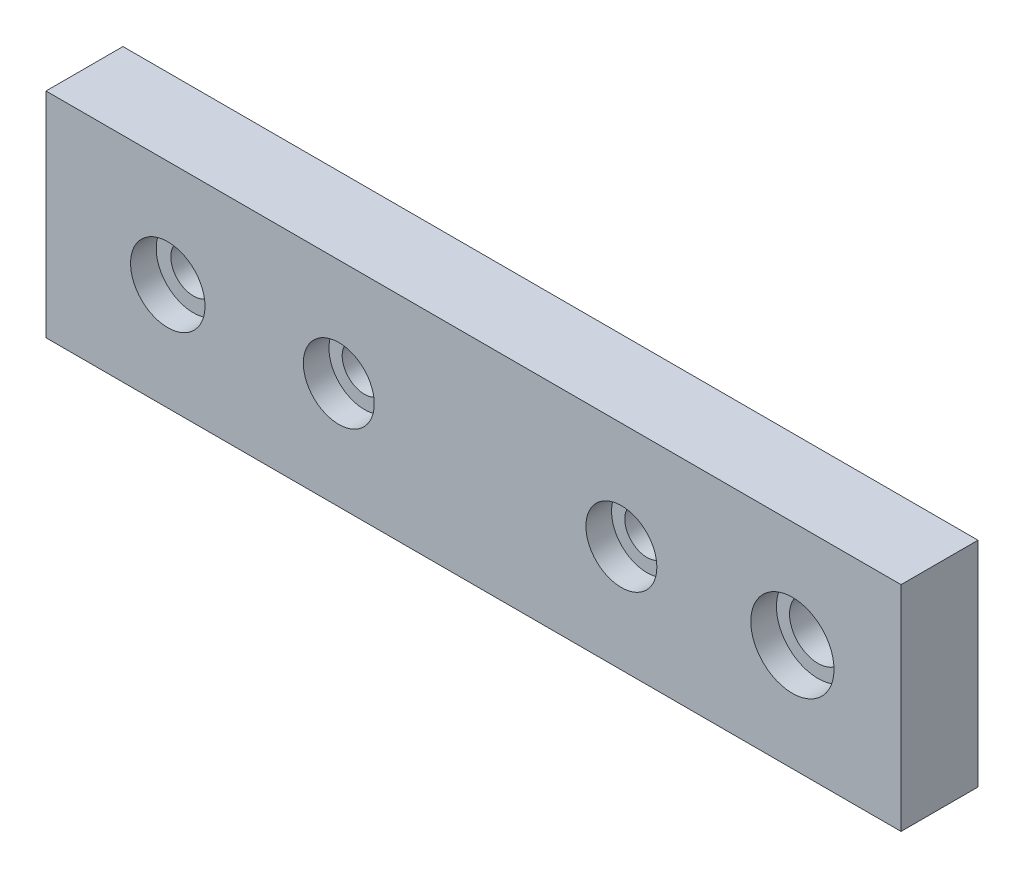
ISO-10303-21;
HEADER;
FILE_DESCRIPTION(('STEP AP214'),'2;1');
FILE_NAME('part.step','',(''),(''),'','','');
FILE_SCHEMA(('AUTOMOTIVE_DESIGN { 1 0 10303 214 1 1 1 1 }'));
ENDSEC;
DATA;
#1=APPLICATION_CONTEXT('core data for automotive mechanical design processes');
#2=APPLICATION_PROTOCOL_DEFINITION('international standard','automotive_design',2000,#1);
#3=PRODUCT_CONTEXT('',#1,'mechanical');
#4=PRODUCT('Part','Part','',(#3));
#5=PRODUCT_RELATED_PRODUCT_CATEGORY('part','',(#4));
#6=PRODUCT_DEFINITION_FORMATION('','',#4);
#7=PRODUCT_DEFINITION_CONTEXT('part definition',#1,'design');
#8=PRODUCT_DEFINITION('design','',#6,#7);
#9=PRODUCT_DEFINITION_SHAPE('','',#8);
#10=(LENGTH_UNIT() NAMED_UNIT(*) SI_UNIT(.MILLI.,.METRE.));
#11=(NAMED_UNIT(*) PLANE_ANGLE_UNIT() SI_UNIT($,.RADIAN.));
#12=(NAMED_UNIT(*) SI_UNIT($,.STERADIAN.) SOLID_ANGLE_UNIT());
#13=UNCERTAINTY_MEASURE_WITH_UNIT(LENGTH_MEASURE(1.E-05),#10,'distance_accuracy_value','');
#14=(GEOMETRIC_REPRESENTATION_CONTEXT(3) GLOBAL_UNCERTAINTY_ASSIGNED_CONTEXT((#13)) GLOBAL_UNIT_ASSIGNED_CONTEXT((#10,
#11,#12)) REPRESENTATION_CONTEXT('',''));
#15=CARTESIAN_POINT('',(0.,0.,0.));
#16=DIRECTION('',(0.,0.,1.));
#17=DIRECTION('',(1.,0.,0.));
#18=AXIS2_PLACEMENT_3D('',#15,#16,#17);
#19=CARTESIAN_POINT('',(116.291637204089,12.5,-75.));
#20=DIRECTION('',(0.,0.,1.));
#21=DIRECTION('',(1.,0.,0.));
#22=AXIS2_PLACEMENT_3D('',#19,#20,#21);
#23=CYLINDRICAL_SURFACE('',#22,3.33518087500682);
#24=CARTESIAN_POINT('',(116.291637204089,12.5,17.5));
#25=DIRECTION('',(0.,0.,1.));
#26=DIRECTION('',(1.,0.,0.));
#27=AXIS2_PLACEMENT_3D('',#24,#25,#26);
#28=CIRCLE('',#27,3.33518087500682);
#29=CARTESIAN_POINT('',(119.626818079095,12.5,17.5));
#30=VERTEX_POINT('',#29);
#31=EDGE_CURVE('E108',#30,#30,#28,.T.);
#32=ORIENTED_EDGE('',*,*,#31,.F.);
#33=EDGE_LOOP('',(#32));
#34=FACE_BOUND('',#33,.T.);
#35=CARTESIAN_POINT('',(116.291637204089,12.5,23.5));
#36=DIRECTION('',(0.,0.,1.));
#37=DIRECTION('',(1.,0.,0.));
#38=AXIS2_PLACEMENT_3D('',#35,#36,#37);
#39=CIRCLE('',#38,3.33518087500682);
#40=CARTESIAN_POINT('',(119.626818079095,12.5,23.5));
#41=VERTEX_POINT('',#40);
#42=EDGE_CURVE('E36',#41,#41,#39,.F.);
#43=ORIENTED_EDGE('',*,*,#42,.F.);
#44=EDGE_LOOP('',(#43));
#45=FACE_BOUND('',#44,.T.);
#46=ADVANCED_FACE('F32',(#34,#45),#23,.F.);
#47=CARTESIAN_POINT('',(43.2405642550662,12.5,-75.));
#48=DIRECTION('',(0.,0.,1.));
#49=DIRECTION('',(1.,0.,0.));
#50=AXIS2_PLACEMENT_3D('',#47,#48,#49);
#51=CYLINDRICAL_SURFACE('',#50,2.64345653870219);
#52=CARTESIAN_POINT('',(43.2405642550662,12.5,17.5));
#53=DIRECTION('',(0.,0.,1.));
#54=DIRECTION('',(1.,0.,0.));
#55=AXIS2_PLACEMENT_3D('',#52,#53,#54);
#56=CIRCLE('',#55,2.64345653870219);
#57=CARTESIAN_POINT('',(45.8840207937684,12.5,17.5));
#58=VERTEX_POINT('',#57);
#59=EDGE_CURVE('E111',#58,#58,#56,.T.);
#60=ORIENTED_EDGE('',*,*,#59,.F.);
#61=EDGE_LOOP('',(#60));
#62=FACE_BOUND('',#61,.T.);
#63=CARTESIAN_POINT('',(43.2405642550662,12.5,23.5));
#64=DIRECTION('',(0.,0.,1.));
#65=DIRECTION('',(1.,0.,0.));
#66=AXIS2_PLACEMENT_3D('',#63,#64,#65);
#67=CIRCLE('',#66,2.64345653870219);
#68=CARTESIAN_POINT('',(45.8840207937684,12.5,23.5));
#69=VERTEX_POINT('',#68);
#70=EDGE_CURVE('E125',#69,#69,#67,.F.);
#71=ORIENTED_EDGE('',*,*,#70,.F.);
#72=EDGE_LOOP('',(#71));
#73=FACE_BOUND('',#72,.T.);
#74=ADVANCED_FACE('F135',(#62,#73),#51,.F.);
#75=CARTESIAN_POINT('',(96.2916372040886,12.5,-75.));
#76=DIRECTION('',(0.,0.,1.));
#77=DIRECTION('',(1.,0.,0.));
#78=AXIS2_PLACEMENT_3D('',#75,#76,#77);
#79=CYLINDRICAL_SURFACE('',#78,2.6);
#80=CARTESIAN_POINT('',(96.2916372040886,12.5,17.5));
#81=DIRECTION('',(0.,0.,1.));
#82=DIRECTION('',(1.,0.,0.));
#83=AXIS2_PLACEMENT_3D('',#80,#81,#82);
#84=CIRCLE('',#83,2.6);
#85=CARTESIAN_POINT('',(98.8916372040886,12.5,17.5));
#86=VERTEX_POINT('',#85);
#87=EDGE_CURVE('E114',#86,#86,#84,.T.);
#88=ORIENTED_EDGE('',*,*,#87,.F.);
#89=EDGE_LOOP('',(#88));
#90=FACE_BOUND('',#89,.T.);
#91=CARTESIAN_POINT('',(96.2916372040886,12.5,23.5));
#92=DIRECTION('',(0.,0.,1.));
#93=DIRECTION('',(1.,0.,0.));
#94=AXIS2_PLACEMENT_3D('',#91,#92,#93);
#95=CIRCLE('',#94,2.6);
#96=CARTESIAN_POINT('',(98.8916372040886,12.5,23.5));
#97=VERTEX_POINT('',#96);
#98=EDGE_CURVE('E122',#97,#97,#95,.F.);
#99=ORIENTED_EDGE('',*,*,#98,.F.);
#100=EDGE_LOOP('',(#99));
#101=FACE_BOUND('',#100,.T.);
#102=ADVANCED_FACE('F141',(#90,#101),#79,.F.);
#103=CARTESIAN_POINT('',(63.2405642550662,12.5,-75.));
#104=DIRECTION('',(0.,0.,1.));
#105=DIRECTION('',(1.,0.,0.));
#106=AXIS2_PLACEMENT_3D('',#103,#104,#105);
#107=CYLINDRICAL_SURFACE('',#106,2.6);
#108=CARTESIAN_POINT('',(63.2405642550662,12.5,17.5));
#109=DIRECTION('',(0.,0.,1.));
#110=DIRECTION('',(1.,0.,0.));
#111=AXIS2_PLACEMENT_3D('',#108,#109,#110);
#112=CIRCLE('',#111,2.6);
#113=CARTESIAN_POINT('',(65.8405642550662,12.5,17.5));
#114=VERTEX_POINT('',#113);
#115=EDGE_CURVE('E102',#114,#114,#112,.T.);
#116=ORIENTED_EDGE('',*,*,#115,.F.);
#117=EDGE_LOOP('',(#116));
#118=FACE_BOUND('',#117,.T.);
#119=CARTESIAN_POINT('',(63.2405642550662,12.5,23.5));
#120=DIRECTION('',(0.,0.,1.));
#121=DIRECTION('',(1.,0.,0.));
#122=AXIS2_PLACEMENT_3D('',#119,#120,#121);
#123=CIRCLE('',#122,2.6);
#124=CARTESIAN_POINT('',(65.8405642550662,12.5,23.5));
#125=VERTEX_POINT('',#124);
#126=EDGE_CURVE('E119',#125,#125,#123,.F.);
#127=ORIENTED_EDGE('',*,*,#126,.F.);
#128=EDGE_LOOP('',(#127));
#129=FACE_BOUND('',#128,.T.);
#130=ADVANCED_FACE('F163',(#118,#129),#107,.F.);
#131=CARTESIAN_POINT('',(129.,0.,26.5));
#132=DIRECTION('',(-1.,0.,0.));
#133=DIRECTION('',(0.,-1.,0.));
#134=AXIS2_PLACEMENT_3D('',#131,#132,#133);
#135=PLANE('',#134);
#136=DIRECTION('',(0.,1.,0.));
#137=VECTOR('',#136,1.);
#138=CARTESIAN_POINT('',(129.,0.,17.5));
#139=LINE('',#138,#137);
#140=CARTESIAN_POINT('',(129.,0.,17.5));
#141=VERTEX_POINT('',#140);
#142=CARTESIAN_POINT('',(129.,25.,17.5));
#143=VERTEX_POINT('',#142);
#144=EDGE_CURVE('E99',#141,#143,#139,.T.);
#145=ORIENTED_EDGE('',*,*,#144,.T.);
#146=DIRECTION('',(0.,0.,-1.));
#147=VECTOR('',#146,1.);
#148=CARTESIAN_POINT('',(129.,25.,26.5));
#149=LINE('',#148,#147);
#150=CARTESIAN_POINT('',(129.,25.,26.5));
#151=VERTEX_POINT('',#150);
#152=EDGE_CURVE('E11',#151,#143,#149,.T.);
#153=ORIENTED_EDGE('',*,*,#152,.F.);
#154=DIRECTION('',(0.,1.,0.));
#155=VECTOR('',#154,1.);
#156=CARTESIAN_POINT('',(129.,0.,26.5));
#157=LINE('',#156,#155);
#158=CARTESIAN_POINT('',(129.,0.,26.5));
#159=VERTEX_POINT('',#158);
#160=EDGE_CURVE('E86',#159,#151,#157,.T.);
#161=ORIENTED_EDGE('',*,*,#160,.F.);
#162=DIRECTION('',(0.,0.,-1.));
#163=VECTOR('',#162,1.);
#164=CARTESIAN_POINT('',(129.,0.,26.5));
#165=LINE('',#164,#163);
#166=EDGE_CURVE('E95',#159,#141,#165,.T.);
#167=ORIENTED_EDGE('',*,*,#166,.T.);
#168=EDGE_LOOP('',(#145,#153,#161,#167));
#169=FACE_BOUND('',#168,.T.);
#170=ADVANCED_FACE('F34',(#169),#135,.F.);
#171=CARTESIAN_POINT('',(129.,25.,26.5));
#172=DIRECTION('',(0.,-1.,0.));
#173=DIRECTION('',(0.,0.,-1.));
#174=AXIS2_PLACEMENT_3D('',#171,#172,#173);
#175=PLANE('',#174);
#176=DIRECTION('',(-1.,0.,0.));
#177=VECTOR('',#176,1.);
#178=CARTESIAN_POINT('',(129.,25.,17.5));
#179=LINE('',#178,#177);
#180=CARTESIAN_POINT('',(29.0000000000001,25.,17.5));
#181=VERTEX_POINT('',#180);
#182=EDGE_CURVE('E90',#143,#181,#179,.T.);
#183=ORIENTED_EDGE('',*,*,#182,.T.);
#184=DIRECTION('',(0.,0.,-1.));
#185=VECTOR('',#184,1.);
#186=CARTESIAN_POINT('',(29.0000000000001,25.,26.5));
#187=LINE('',#186,#185);
#188=CARTESIAN_POINT('',(29.0000000000001,25.,26.5));
#189=VERTEX_POINT('',#188);
#190=EDGE_CURVE('E42',#189,#181,#187,.T.);
#191=ORIENTED_EDGE('',*,*,#190,.F.);
#192=DIRECTION('',(-1.,0.,0.));
#193=VECTOR('',#192,1.);
#194=CARTESIAN_POINT('',(129.,25.,26.5));
#195=LINE('',#194,#193);
#196=EDGE_CURVE('E81',#151,#189,#195,.T.);
#197=ORIENTED_EDGE('',*,*,#196,.F.);
#198=ORIENTED_EDGE('',*,*,#152,.T.);
#199=EDGE_LOOP('',(#183,#191,#197,#198));
#200=FACE_BOUND('',#199,.T.);
#201=ADVANCED_FACE('F89',(#200),#175,.F.);
#202=CARTESIAN_POINT('',(29.0000000000001,25.,26.5));
#203=DIRECTION('',(1.,0.,0.));
#204=DIRECTION('',(0.,0.,-1.));
#205=AXIS2_PLACEMENT_3D('',#202,#203,#204);
#206=PLANE('',#205);
#207=DIRECTION('',(0.,-1.,0.));
#208=VECTOR('',#207,1.);
#209=CARTESIAN_POINT('',(29.0000000000001,25.,17.5));
#210=LINE('',#209,#208);
#211=CARTESIAN_POINT('',(29.0000000000001,0.,17.5));
#212=VERTEX_POINT('',#211);
#213=EDGE_CURVE('E68',#181,#212,#210,.T.);
#214=ORIENTED_EDGE('',*,*,#213,.T.);
#215=DIRECTION('',(0.,0.,-1.));
#216=VECTOR('',#215,1.);
#217=CARTESIAN_POINT('',(29.0000000000001,0.,26.5));
#218=LINE('',#217,#216);
#219=CARTESIAN_POINT('',(29.0000000000001,0.,26.5));
#220=VERTEX_POINT('',#219);
#221=EDGE_CURVE('E91',#220,#212,#218,.T.);
#222=ORIENTED_EDGE('',*,*,#221,.F.);
#223=DIRECTION('',(0.,-1.,0.));
#224=VECTOR('',#223,1.);
#225=CARTESIAN_POINT('',(29.0000000000001,25.,26.5));
#226=LINE('',#225,#224);
#227=EDGE_CURVE('E84',#189,#220,#226,.T.);
#228=ORIENTED_EDGE('',*,*,#227,.F.);
#229=ORIENTED_EDGE('',*,*,#190,.T.);
#230=EDGE_LOOP('',(#214,#222,#228,#229));
#231=FACE_BOUND('',#230,.T.);
#232=ADVANCED_FACE('F93',(#231),#206,.F.);
#233=CARTESIAN_POINT('',(29.0000000000001,0.,26.5));
#234=DIRECTION('',(0.,1.,0.));
#235=DIRECTION('',(-1.,0.,0.));
#236=AXIS2_PLACEMENT_3D('',#233,#234,#235);
#237=PLANE('',#236);
#238=DIRECTION('',(1.,0.,0.));
#239=VECTOR('',#238,1.);
#240=CARTESIAN_POINT('',(29.0000000000001,0.,17.5));
#241=LINE('',#240,#239);
#242=EDGE_CURVE('E74',#212,#141,#241,.T.);
#243=ORIENTED_EDGE('',*,*,#242,.T.);
#244=ORIENTED_EDGE('',*,*,#166,.F.);
#245=DIRECTION('',(1.,0.,0.));
#246=VECTOR('',#245,1.);
#247=CARTESIAN_POINT('',(29.0000000000001,0.,26.5));
#248=LINE('',#247,#246);
#249=EDGE_CURVE('E51',#220,#159,#248,.T.);
#250=ORIENTED_EDGE('',*,*,#249,.F.);
#251=ORIENTED_EDGE('',*,*,#221,.T.);
#252=EDGE_LOOP('',(#243,#244,#250,#251));
#253=FACE_BOUND('',#252,.T.);
#254=ADVANCED_FACE('F150',(#253),#237,.F.);
#255=CARTESIAN_POINT('',(0.,0.,26.5));
#256=DIRECTION('',(0.,0.,1.));
#257=DIRECTION('',(1.,0.,0.));
#258=AXIS2_PLACEMENT_3D('',#255,#256,#257);
#259=PLANE('',#258);
#260=CARTESIAN_POINT('',(96.2916372040886,12.5,26.5));
#261=DIRECTION('',(0.,0.,1.));
#262=DIRECTION('',(1.,0.,0.));
#263=AXIS2_PLACEMENT_3D('',#260,#261,#262);
#264=CIRCLE('',#263,4.15);
#265=CARTESIAN_POINT('',(100.441637204089,12.5,26.5));
#266=VERTEX_POINT('',#265);
#267=EDGE_CURVE('E191',#266,#266,#264,.T.);
#268=ORIENTED_EDGE('',*,*,#267,.F.);
#269=EDGE_LOOP('',(#268));
#270=FACE_BOUND('',#269,.T.);
#271=CARTESIAN_POINT('',(63.2405642550662,12.5,26.5));
#272=DIRECTION('',(0.,0.,1.));
#273=DIRECTION('',(1.,0.,0.));
#274=AXIS2_PLACEMENT_3D('',#271,#272,#273);
#275=CIRCLE('',#274,4.15);
#276=CARTESIAN_POINT('',(67.3905642550662,12.5,26.5));
#277=VERTEX_POINT('',#276);
#278=EDGE_CURVE('E185',#277,#277,#275,.T.);
#279=ORIENTED_EDGE('',*,*,#278,.F.);
#280=EDGE_LOOP('',(#279));
#281=FACE_BOUND('',#280,.T.);
#282=CARTESIAN_POINT('',(43.2405642550662,12.5,26.5));
#283=DIRECTION('',(0.,0.,1.));
#284=DIRECTION('',(1.,0.,0.));
#285=AXIS2_PLACEMENT_3D('',#282,#283,#284);
#286=CIRCLE('',#285,4.35278385630602);
#287=CARTESIAN_POINT('',(47.5933481113722,12.5,26.5));
#288=VERTEX_POINT('',#287);
#289=EDGE_CURVE('E179',#288,#288,#286,.T.);
#290=ORIENTED_EDGE('',*,*,#289,.F.);
#291=EDGE_LOOP('',(#290));
#292=FACE_BOUND('',#291,.T.);
#293=CARTESIAN_POINT('',(116.291637204089,12.5,26.5));
#294=DIRECTION('',(0.,0.,1.));
#295=DIRECTION('',(1.,0.,0.));
#296=AXIS2_PLACEMENT_3D('',#293,#294,#295);
#297=CIRCLE('',#296,4.86683196025633);
#298=CARTESIAN_POINT('',(121.158469164345,12.5,26.5));
#299=VERTEX_POINT('',#298);
#300=EDGE_CURVE('E173',#299,#299,#297,.T.);
#301=ORIENTED_EDGE('',*,*,#300,.F.);
#302=EDGE_LOOP('',(#301));
#303=FACE_BOUND('',#302,.T.);
#304=ORIENTED_EDGE('',*,*,#160,.T.);
#305=ORIENTED_EDGE('',*,*,#196,.T.);
#306=ORIENTED_EDGE('',*,*,#227,.T.);
#307=ORIENTED_EDGE('',*,*,#249,.T.);
#308=EDGE_LOOP('',(#304,#305,#306,#307));
#309=FACE_BOUND('',#308,.T.);
#310=ADVANCED_FACE('F82',(#270,#281,#292,#303,#309),#259,.T.);
#311=CARTESIAN_POINT('',(0.,0.,17.5));
#312=DIRECTION('',(0.,0.,1.));
#313=DIRECTION('',(1.,0.,0.));
#314=AXIS2_PLACEMENT_3D('',#311,#312,#313);
#315=PLANE('',#314);
#316=ORIENTED_EDGE('',*,*,#115,.T.);
#317=EDGE_LOOP('',(#316));
#318=FACE_BOUND('',#317,.T.);
#319=ORIENTED_EDGE('',*,*,#87,.T.);
#320=EDGE_LOOP('',(#319));
#321=FACE_BOUND('',#320,.T.);
#322=ORIENTED_EDGE('',*,*,#59,.T.);
#323=EDGE_LOOP('',(#322));
#324=FACE_BOUND('',#323,.T.);
#325=ORIENTED_EDGE('',*,*,#31,.T.);
#326=EDGE_LOOP('',(#325));
#327=FACE_BOUND('',#326,.T.);
#328=ORIENTED_EDGE('',*,*,#144,.F.);
#329=ORIENTED_EDGE('',*,*,#242,.F.);
#330=ORIENTED_EDGE('',*,*,#213,.F.);
#331=ORIENTED_EDGE('',*,*,#182,.F.);
#332=EDGE_LOOP('',(#328,#329,#330,#331));
#333=FACE_BOUND('',#332,.T.);
#334=ADVANCED_FACE('F149',(#318,#321,#324,#327,#333),#315,.F.);
#335=CARTESIAN_POINT('',(63.2405642550662,12.5,23.5));
#336=DIRECTION('',(0.,0.,1.));
#337=DIRECTION('',(1.,0.,0.));
#338=AXIS2_PLACEMENT_3D('',#335,#336,#337);
#339=PLANE('',#338);
#340=CARTESIAN_POINT('',(63.2405642550662,12.5,23.5));
#341=DIRECTION('',(0.,0.,1.));
#342=DIRECTION('',(1.,0.,0.));
#343=AXIS2_PLACEMENT_3D('',#340,#341,#342);
#344=CIRCLE('',#343,4.15);
#345=CARTESIAN_POINT('',(67.3905642550662,12.5,23.5));
#346=VERTEX_POINT('',#345);
#347=EDGE_CURVE('E188',#346,#346,#344,.T.);
#348=ORIENTED_EDGE('',*,*,#347,.T.);
#349=EDGE_LOOP('',(#348));
#350=FACE_BOUND('',#349,.T.);
#351=ORIENTED_EDGE('',*,*,#126,.T.);
#352=EDGE_LOOP('',(#351));
#353=FACE_BOUND('',#352,.T.);
#354=ADVANCED_FACE('F154',(#350,#353),#339,.T.);
#355=CARTESIAN_POINT('',(63.2405642550662,12.5,23.5));
#356=DIRECTION('',(0.,0.,1.));
#357=DIRECTION('',(1.,0.,0.));
#358=AXIS2_PLACEMENT_3D('',#355,#356,#357);
#359=CYLINDRICAL_SURFACE('',#358,4.15);
#360=ORIENTED_EDGE('',*,*,#347,.F.);
#361=EDGE_LOOP('',(#360));
#362=FACE_BOUND('',#361,.T.);
#363=ORIENTED_EDGE('',*,*,#278,.T.);
#364=EDGE_LOOP('',(#363));
#365=FACE_BOUND('',#364,.T.);
#366=ADVANCED_FACE('F233',(#362,#365),#359,.F.);
#367=CARTESIAN_POINT('',(96.2916372040886,12.5,23.5));
#368=DIRECTION('',(0.,0.,1.));
#369=DIRECTION('',(1.,0.,0.));
#370=AXIS2_PLACEMENT_3D('',#367,#368,#369);
#371=PLANE('',#370);
#372=CARTESIAN_POINT('',(96.2916372040886,12.5,23.5));
#373=DIRECTION('',(0.,0.,1.));
#374=DIRECTION('',(1.,0.,0.));
#375=AXIS2_PLACEMENT_3D('',#372,#373,#374);
#376=CIRCLE('',#375,4.15);
#377=CARTESIAN_POINT('',(100.441637204089,12.5,23.5));
#378=VERTEX_POINT('',#377);
#379=EDGE_CURVE('E123',#378,#378,#376,.T.);
#380=ORIENTED_EDGE('',*,*,#379,.T.);
#381=EDGE_LOOP('',(#380));
#382=FACE_BOUND('',#381,.T.);
#383=ORIENTED_EDGE('',*,*,#98,.T.);
#384=EDGE_LOOP('',(#383));
#385=FACE_BOUND('',#384,.T.);
#386=ADVANCED_FACE('F197',(#382,#385),#371,.T.);
#387=CARTESIAN_POINT('',(96.2916372040886,12.5,23.5));
#388=DIRECTION('',(0.,0.,1.));
#389=DIRECTION('',(1.,0.,0.));
#390=AXIS2_PLACEMENT_3D('',#387,#388,#389);
#391=CYLINDRICAL_SURFACE('',#390,4.15);
#392=ORIENTED_EDGE('',*,*,#379,.F.);
#393=EDGE_LOOP('',(#392));
#394=FACE_BOUND('',#393,.T.);
#395=ORIENTED_EDGE('',*,*,#267,.T.);
#396=EDGE_LOOP('',(#395));
#397=FACE_BOUND('',#396,.T.);
#398=ADVANCED_FACE('F200',(#394,#397),#391,.F.);
#399=CARTESIAN_POINT('',(43.2405642550662,12.5,23.5));
#400=DIRECTION('',(0.,0.,1.));
#401=DIRECTION('',(1.,0.,0.));
#402=AXIS2_PLACEMENT_3D('',#399,#400,#401);
#403=PLANE('',#402);
#404=CARTESIAN_POINT('',(43.2405642550662,12.5,23.5));
#405=DIRECTION('',(0.,0.,1.));
#406=DIRECTION('',(1.,0.,0.));
#407=AXIS2_PLACEMENT_3D('',#404,#405,#406);
#408=CIRCLE('',#407,4.35278385630602);
#409=CARTESIAN_POINT('',(47.5933481113722,12.5,23.5));
#410=VERTEX_POINT('',#409);
#411=EDGE_CURVE('E182',#410,#410,#408,.T.);
#412=ORIENTED_EDGE('',*,*,#411,.T.);
#413=EDGE_LOOP('',(#412));
#414=FACE_BOUND('',#413,.T.);
#415=ORIENTED_EDGE('',*,*,#70,.T.);
#416=EDGE_LOOP('',(#415));
#417=FACE_BOUND('',#416,.T.);
#418=ADVANCED_FACE('F203',(#414,#417),#403,.T.);
#419=CARTESIAN_POINT('',(43.2405642550662,12.5,23.5));
#420=DIRECTION('',(0.,0.,1.));
#421=DIRECTION('',(1.,0.,0.));
#422=AXIS2_PLACEMENT_3D('',#419,#420,#421);
#423=CYLINDRICAL_SURFACE('',#422,4.35278385630602);
#424=ORIENTED_EDGE('',*,*,#411,.F.);
#425=EDGE_LOOP('',(#424));
#426=FACE_BOUND('',#425,.T.);
#427=ORIENTED_EDGE('',*,*,#289,.T.);
#428=EDGE_LOOP('',(#427));
#429=FACE_BOUND('',#428,.T.);
#430=ADVANCED_FACE('F220',(#426,#429),#423,.F.);
#431=CARTESIAN_POINT('',(116.291637204089,12.5,23.5));
#432=DIRECTION('',(0.,0.,1.));
#433=DIRECTION('',(1.,0.,0.));
#434=AXIS2_PLACEMENT_3D('',#431,#432,#433);
#435=PLANE('',#434);
#436=CARTESIAN_POINT('',(116.291637204089,12.5,23.5));
#437=DIRECTION('',(0.,0.,1.));
#438=DIRECTION('',(1.,0.,0.));
#439=AXIS2_PLACEMENT_3D('',#436,#437,#438);
#440=CIRCLE('',#439,4.86683196025633);
#441=CARTESIAN_POINT('',(121.158469164345,12.5,23.5));
#442=VERTEX_POINT('',#441);
#443=EDGE_CURVE('E176',#442,#442,#440,.T.);
#444=ORIENTED_EDGE('',*,*,#443,.T.);
#445=EDGE_LOOP('',(#444));
#446=FACE_BOUND('',#445,.T.);
#447=ORIENTED_EDGE('',*,*,#42,.T.);
#448=EDGE_LOOP('',(#447));
#449=FACE_BOUND('',#448,.T.);
#450=ADVANCED_FACE('F132',(#446,#449),#435,.T.);
#451=CARTESIAN_POINT('',(116.291637204089,12.5,23.5));
#452=DIRECTION('',(0.,0.,1.));
#453=DIRECTION('',(1.,0.,0.));
#454=AXIS2_PLACEMENT_3D('',#451,#452,#453);
#455=CYLINDRICAL_SURFACE('',#454,4.86683196025633);
#456=ORIENTED_EDGE('',*,*,#443,.F.);
#457=EDGE_LOOP('',(#456));
#458=FACE_BOUND('',#457,.T.);
#459=ORIENTED_EDGE('',*,*,#300,.T.);
#460=EDGE_LOOP('',(#459));
#461=FACE_BOUND('',#460,.T.);
#462=ADVANCED_FACE('F213',(#458,#461),#455,.F.);
#463=CLOSED_SHELL('',(#46,#74,#102,#130,#170,#201,#232,#254,#310,#334,#354,#366,#386,#398,#418,
#430,#450,#462));
#464=MANIFOLD_SOLID_BREP('B2',#463);
#465=ADVANCED_BREP_SHAPE_REPRESENTATION('',(#18,#464),#14);
#466=SHAPE_DEFINITION_REPRESENTATION(#9,#465);
ENDSEC;
END-ISO-10303-21;
